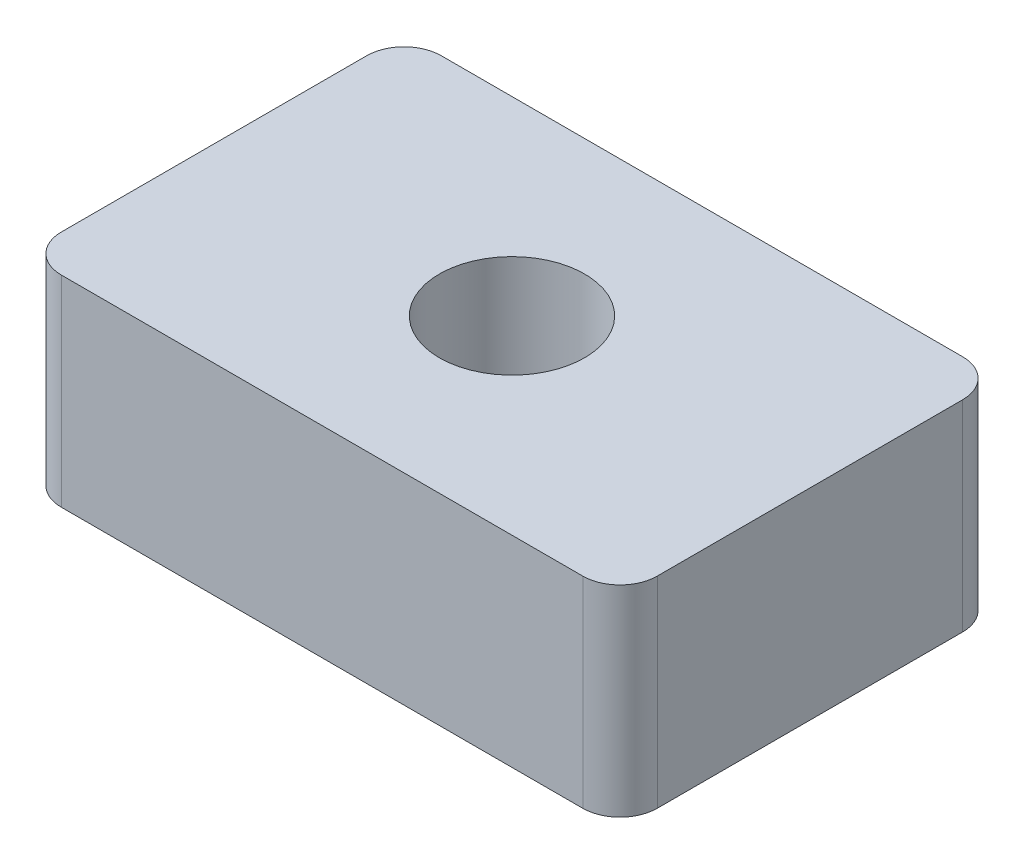
ISO-10303-21;
HEADER;
FILE_DESCRIPTION(('STEP AP214'),'2;1');
FILE_NAME('part.step','',(''),(''),'','','');
FILE_SCHEMA(('AUTOMOTIVE_DESIGN { 1 0 10303 214 1 1 1 1 }'));
ENDSEC;
DATA;
#1=APPLICATION_CONTEXT('core data for automotive mechanical design processes');
#2=APPLICATION_PROTOCOL_DEFINITION('international standard','automotive_design',2000,#1);
#3=PRODUCT_CONTEXT('',#1,'mechanical');
#4=PRODUCT('Part','Part','',(#3));
#5=PRODUCT_RELATED_PRODUCT_CATEGORY('part','',(#4));
#6=PRODUCT_DEFINITION_FORMATION('','',#4);
#7=PRODUCT_DEFINITION_CONTEXT('part definition',#1,'design');
#8=PRODUCT_DEFINITION('design','',#6,#7);
#9=PRODUCT_DEFINITION_SHAPE('','',#8);
#10=(LENGTH_UNIT() NAMED_UNIT(*) SI_UNIT(.MILLI.,.METRE.));
#11=(NAMED_UNIT(*) PLANE_ANGLE_UNIT() SI_UNIT($,.RADIAN.));
#12=(NAMED_UNIT(*) SI_UNIT($,.STERADIAN.) SOLID_ANGLE_UNIT());
#13=UNCERTAINTY_MEASURE_WITH_UNIT(LENGTH_MEASURE(1.E-05),#10,'distance_accuracy_value','');
#14=(GEOMETRIC_REPRESENTATION_CONTEXT(3) GLOBAL_UNCERTAINTY_ASSIGNED_CONTEXT((#13)) GLOBAL_UNIT_ASSIGNED_CONTEXT((#10,
#11,#12)) REPRESENTATION_CONTEXT('',''));
#15=CARTESIAN_POINT('',(0.,0.,0.));
#16=DIRECTION('',(0.,0.,1.));
#17=DIRECTION('',(1.,0.,0.));
#18=AXIS2_PLACEMENT_3D('',#15,#16,#17);
#19=CARTESIAN_POINT('',(0.,27.,0.));
#20=DIRECTION('',(1.,0.,0.));
#21=DIRECTION('',(0.,0.,-1.));
#22=AXIS2_PLACEMENT_3D('',#19,#20,#21);
#23=PLANE('',#22);
#24=DIRECTION('',(0.,0.,1.));
#25=VECTOR('',#24,1.);
#26=CARTESIAN_POINT('',(0.,27.,0.));
#27=LINE('',#26,#25);
#28=CARTESIAN_POINT('',(0.,27.,-46.));
#29=VERTEX_POINT('',#28);
#30=CARTESIAN_POINT('',(0.,27.,-5.));
#31=VERTEX_POINT('',#30);
#32=EDGE_CURVE('E132',#29,#31,#27,.T.);
#33=ORIENTED_EDGE('',*,*,#32,.F.);
#34=DIRECTION('',(0.,-1.,0.));
#35=VECTOR('',#34,1.);
#36=CARTESIAN_POINT('',(0.,27.,-46.));
#37=LINE('',#36,#35);
#38=CARTESIAN_POINT('',(0.,0.,-46.));
#39=VERTEX_POINT('',#38);
#40=EDGE_CURVE('E116',#29,#39,#37,.T.);
#41=ORIENTED_EDGE('',*,*,#40,.T.);
#42=DIRECTION('',(0.,0.,1.));
#43=VECTOR('',#42,1.);
#44=CARTESIAN_POINT('',(0.,0.,0.));
#45=LINE('',#44,#43);
#46=CARTESIAN_POINT('',(0.,0.,-5.));
#47=VERTEX_POINT('',#46);
#48=EDGE_CURVE('E129',#39,#47,#45,.T.);
#49=ORIENTED_EDGE('',*,*,#48,.T.);
#50=DIRECTION('',(0.,-1.,0.));
#51=VECTOR('',#50,1.);
#52=CARTESIAN_POINT('',(0.,27.,-5.));
#53=LINE('',#52,#51);
#54=EDGE_CURVE('E135',#47,#31,#53,.F.);
#55=ORIENTED_EDGE('',*,*,#54,.T.);
#56=EDGE_LOOP('',(#33,#41,#49,#55));
#57=FACE_BOUND('',#56,.T.);
#58=ADVANCED_FACE('F45',(#57),#23,.F.);
#59=CARTESIAN_POINT('',(0.,27.,0.));
#60=DIRECTION('',(0.,0.,-1.));
#61=DIRECTION('',(-1.,0.,0.));
#62=AXIS2_PLACEMENT_3D('',#59,#60,#61);
#63=PLANE('',#62);
#64=DIRECTION('',(1.,0.,0.));
#65=VECTOR('',#64,1.);
#66=CARTESIAN_POINT('',(0.,0.,0.));
#67=LINE('',#66,#65);
#68=CARTESIAN_POINT('',(5.,0.,0.));
#69=VERTEX_POINT('',#68);
#70=CARTESIAN_POINT('',(75.,0.,0.));
#71=VERTEX_POINT('',#70);
#72=EDGE_CURVE('E140',#69,#71,#67,.T.);
#73=ORIENTED_EDGE('',*,*,#72,.T.);
#74=DIRECTION('',(0.,-1.,0.));
#75=VECTOR('',#74,1.);
#76=CARTESIAN_POINT('',(75.,27.,0.));
#77=LINE('',#76,#75);
#78=CARTESIAN_POINT('',(75.,27.,0.));
#79=VERTEX_POINT('',#78);
#80=EDGE_CURVE('E11',#71,#79,#77,.F.);
#81=ORIENTED_EDGE('',*,*,#80,.T.);
#82=DIRECTION('',(1.,0.,0.));
#83=VECTOR('',#82,1.);
#84=CARTESIAN_POINT('',(0.,27.,0.));
#85=LINE('',#84,#83);
#86=CARTESIAN_POINT('',(5.,27.,0.));
#87=VERTEX_POINT('',#86);
#88=EDGE_CURVE('E197',#87,#79,#85,.T.);
#89=ORIENTED_EDGE('',*,*,#88,.F.);
#90=DIRECTION('',(0.,-1.,0.));
#91=VECTOR('',#90,1.);
#92=CARTESIAN_POINT('',(5.,27.,0.));
#93=LINE('',#92,#91);
#94=EDGE_CURVE('E54',#87,#69,#93,.T.);
#95=ORIENTED_EDGE('',*,*,#94,.T.);
#96=EDGE_LOOP('',(#73,#81,#89,#95));
#97=FACE_BOUND('',#96,.T.);
#98=ADVANCED_FACE('F195',(#97),#63,.F.);
#99=CARTESIAN_POINT('',(80.,27.,0.));
#100=DIRECTION('',(-1.,0.,0.));
#101=DIRECTION('',(0.,0.,1.));
#102=AXIS2_PLACEMENT_3D('',#99,#100,#101);
#103=PLANE('',#102);
#104=DIRECTION('',(0.,0.,-1.));
#105=VECTOR('',#104,1.);
#106=CARTESIAN_POINT('',(80.,0.,0.));
#107=LINE('',#106,#105);
#108=CARTESIAN_POINT('',(80.,0.,-5.));
#109=VERTEX_POINT('',#108);
#110=CARTESIAN_POINT('',(80.,0.,-46.));
#111=VERTEX_POINT('',#110);
#112=EDGE_CURVE('E146',#109,#111,#107,.T.);
#113=ORIENTED_EDGE('',*,*,#112,.T.);
#114=DIRECTION('',(0.,-1.,0.));
#115=VECTOR('',#114,1.);
#116=CARTESIAN_POINT('',(80.,27.,-46.));
#117=LINE('',#116,#115);
#118=CARTESIAN_POINT('',(80.,27.,-46.));
#119=VERTEX_POINT('',#118);
#120=EDGE_CURVE('E61',#111,#119,#117,.F.);
#121=ORIENTED_EDGE('',*,*,#120,.T.);
#122=DIRECTION('',(0.,0.,-1.));
#123=VECTOR('',#122,1.);
#124=CARTESIAN_POINT('',(80.,27.,0.));
#125=LINE('',#124,#123);
#126=CARTESIAN_POINT('',(80.,27.,-5.));
#127=VERTEX_POINT('',#126);
#128=EDGE_CURVE('E205',#127,#119,#125,.T.);
#129=ORIENTED_EDGE('',*,*,#128,.F.);
#130=DIRECTION('',(0.,-1.,0.));
#131=VECTOR('',#130,1.);
#132=CARTESIAN_POINT('',(80.,27.,-5.));
#133=LINE('',#132,#131);
#134=EDGE_CURVE('E185',#127,#109,#133,.T.);
#135=ORIENTED_EDGE('',*,*,#134,.T.);
#136=EDGE_LOOP('',(#113,#121,#129,#135));
#137=FACE_BOUND('',#136,.T.);
#138=ADVANCED_FACE('F204',(#137),#103,.F.);
#139=CARTESIAN_POINT('',(0.,27.,-51.));
#140=DIRECTION('',(0.,0.,1.));
#141=DIRECTION('',(1.,0.,0.));
#142=AXIS2_PLACEMENT_3D('',#139,#140,#141);
#143=PLANE('',#142);
#144=DIRECTION('',(-1.,0.,0.));
#145=VECTOR('',#144,1.);
#146=CARTESIAN_POINT('',(0.,0.,-51.));
#147=LINE('',#146,#145);
#148=CARTESIAN_POINT('',(75.,0.,-51.));
#149=VERTEX_POINT('',#148);
#150=CARTESIAN_POINT('',(5.,0.,-51.));
#151=VERTEX_POINT('',#150);
#152=EDGE_CURVE('E157',#149,#151,#147,.T.);
#153=ORIENTED_EDGE('',*,*,#152,.T.);
#154=DIRECTION('',(0.,-1.,0.));
#155=VECTOR('',#154,1.);
#156=CARTESIAN_POINT('',(5.,27.,-51.));
#157=LINE('',#156,#155);
#158=CARTESIAN_POINT('',(5.,27.,-51.));
#159=VERTEX_POINT('',#158);
#160=EDGE_CURVE('E117',#151,#159,#157,.F.);
#161=ORIENTED_EDGE('',*,*,#160,.T.);
#162=DIRECTION('',(-1.,0.,0.));
#163=VECTOR('',#162,1.);
#164=CARTESIAN_POINT('',(0.,27.,-51.));
#165=LINE('',#164,#163);
#166=CARTESIAN_POINT('',(75.,27.,-51.));
#167=VERTEX_POINT('',#166);
#168=EDGE_CURVE('E152',#167,#159,#165,.T.);
#169=ORIENTED_EDGE('',*,*,#168,.F.);
#170=DIRECTION('',(0.,-1.,0.));
#171=VECTOR('',#170,1.);
#172=CARTESIAN_POINT('',(75.,27.,-51.));
#173=LINE('',#172,#171);
#174=EDGE_CURVE('E123',#167,#149,#173,.T.);
#175=ORIENTED_EDGE('',*,*,#174,.T.);
#176=EDGE_LOOP('',(#153,#161,#169,#175));
#177=FACE_BOUND('',#176,.T.);
#178=ADVANCED_FACE('F223',(#177),#143,.F.);
#179=CARTESIAN_POINT('',(0.,27.,0.));
#180=DIRECTION('',(0.,-1.,0.));
#181=DIRECTION('',(0.,0.,-1.));
#182=AXIS2_PLACEMENT_3D('',#179,#180,#181);
#183=PLANE('',#182);
#184=CARTESIAN_POINT('',(40.,27.,-25.5));
#185=DIRECTION('',(0.,1.,0.));
#186=DIRECTION('',(0.,0.,1.));
#187=AXIS2_PLACEMENT_3D('',#184,#185,#186);
#188=CIRCLE('',#187,9.75);
#189=CARTESIAN_POINT('',(40.,27.,-15.75));
#190=VERTEX_POINT('',#189);
#191=EDGE_CURVE('E149',#190,#190,#188,.T.);
#192=ORIENTED_EDGE('',*,*,#191,.F.);
#193=EDGE_LOOP('',(#192));
#194=FACE_BOUND('',#193,.T.);
#195=ORIENTED_EDGE('',*,*,#168,.T.);
#196=CARTESIAN_POINT('',(5.,27.,-46.));
#197=DIRECTION('',(0.,-1.,0.));
#198=DIRECTION('',(0.,0.,-1.));
#199=AXIS2_PLACEMENT_3D('',#196,#197,#198);
#200=CIRCLE('',#199,5.);
#201=EDGE_CURVE('E182',#159,#29,#200,.F.);
#202=ORIENTED_EDGE('',*,*,#201,.T.);
#203=ORIENTED_EDGE('',*,*,#32,.T.);
#204=CARTESIAN_POINT('',(5.,27.,-5.));
#205=DIRECTION('',(0.,-1.,0.));
#206=DIRECTION('',(0.,0.,-1.));
#207=AXIS2_PLACEMENT_3D('',#204,#205,#206);
#208=CIRCLE('',#207,5.);
#209=EDGE_CURVE('E174',#31,#87,#208,.F.);
#210=ORIENTED_EDGE('',*,*,#209,.T.);
#211=ORIENTED_EDGE('',*,*,#88,.T.);
#212=CARTESIAN_POINT('',(75.,27.,-5.));
#213=DIRECTION('',(0.,-1.,0.));
#214=DIRECTION('',(0.,0.,-1.));
#215=AXIS2_PLACEMENT_3D('',#212,#213,#214);
#216=CIRCLE('',#215,5.);
#217=EDGE_CURVE('E68',#79,#127,#216,.F.);
#218=ORIENTED_EDGE('',*,*,#217,.T.);
#219=ORIENTED_EDGE('',*,*,#128,.T.);
#220=CARTESIAN_POINT('',(75.,27.,-46.));
#221=DIRECTION('',(0.,-1.,0.));
#222=DIRECTION('',(0.,0.,-1.));
#223=AXIS2_PLACEMENT_3D('',#220,#221,#222);
#224=CIRCLE('',#223,5.);
#225=EDGE_CURVE('E179',#119,#167,#224,.F.);
#226=ORIENTED_EDGE('',*,*,#225,.T.);
#227=EDGE_LOOP('',(#195,#202,#203,#210,#211,#218,#219,#226));
#228=FACE_BOUND('',#227,.T.);
#229=ADVANCED_FACE('F221',(#194,#228),#183,.F.);
#230=CARTESIAN_POINT('',(0.,0.,0.));
#231=DIRECTION('',(0.,-1.,0.));
#232=DIRECTION('',(0.,0.,-1.));
#233=AXIS2_PLACEMENT_3D('',#230,#231,#232);
#234=PLANE('',#233);
#235=CARTESIAN_POINT('',(40.,0.,-25.5));
#236=DIRECTION('',(0.,1.,0.));
#237=DIRECTION('',(0.,0.,1.));
#238=AXIS2_PLACEMENT_3D('',#235,#236,#237);
#239=CIRCLE('',#238,9.75);
#240=CARTESIAN_POINT('',(40.,0.,-15.75));
#241=VERTEX_POINT('',#240);
#242=EDGE_CURVE('E141',#241,#241,#239,.T.);
#243=ORIENTED_EDGE('',*,*,#242,.T.);
#244=EDGE_LOOP('',(#243));
#245=FACE_BOUND('',#244,.T.);
#246=ORIENTED_EDGE('',*,*,#48,.F.);
#247=CARTESIAN_POINT('',(5.,0.,-46.));
#248=DIRECTION('',(0.,-1.,0.));
#249=DIRECTION('',(0.,0.,-1.));
#250=AXIS2_PLACEMENT_3D('',#247,#248,#249);
#251=CIRCLE('',#250,5.);
#252=EDGE_CURVE('E112',#39,#151,#251,.T.);
#253=ORIENTED_EDGE('',*,*,#252,.T.);
#254=ORIENTED_EDGE('',*,*,#152,.F.);
#255=CARTESIAN_POINT('',(75.,0.,-46.));
#256=DIRECTION('',(0.,-1.,0.));
#257=DIRECTION('',(0.,0.,-1.));
#258=AXIS2_PLACEMENT_3D('',#255,#256,#257);
#259=CIRCLE('',#258,5.);
#260=EDGE_CURVE('E124',#149,#111,#259,.T.);
#261=ORIENTED_EDGE('',*,*,#260,.T.);
#262=ORIENTED_EDGE('',*,*,#112,.F.);
#263=CARTESIAN_POINT('',(75.,0.,-5.));
#264=DIRECTION('',(0.,-1.,0.));
#265=DIRECTION('',(0.,0.,-1.));
#266=AXIS2_PLACEMENT_3D('',#263,#264,#265);
#267=CIRCLE('',#266,5.);
#268=EDGE_CURVE('E164',#109,#71,#267,.T.);
#269=ORIENTED_EDGE('',*,*,#268,.T.);
#270=ORIENTED_EDGE('',*,*,#72,.F.);
#271=CARTESIAN_POINT('',(5.,0.,-5.));
#272=DIRECTION('',(0.,-1.,0.));
#273=DIRECTION('',(0.,0.,-1.));
#274=AXIS2_PLACEMENT_3D('',#271,#272,#273);
#275=CIRCLE('',#274,5.);
#276=EDGE_CURVE('E134',#69,#47,#275,.T.);
#277=ORIENTED_EDGE('',*,*,#276,.T.);
#278=EDGE_LOOP('',(#246,#253,#254,#261,#262,#269,#270,#277));
#279=FACE_BOUND('',#278,.T.);
#280=ADVANCED_FACE('F137',(#245,#279),#234,.T.);
#281=CARTESIAN_POINT('',(40.,0.,-25.5));
#282=DIRECTION('',(0.,1.,0.));
#283=DIRECTION('',(0.,0.,1.));
#284=AXIS2_PLACEMENT_3D('',#281,#282,#283);
#285=CYLINDRICAL_SURFACE('',#284,9.75);
#286=ORIENTED_EDGE('',*,*,#242,.F.);
#287=EDGE_LOOP('',(#286));
#288=FACE_BOUND('',#287,.T.);
#289=ORIENTED_EDGE('',*,*,#191,.T.);
#290=EDGE_LOOP('',(#289));
#291=FACE_BOUND('',#290,.T.);
#292=ADVANCED_FACE('F219',(#288,#291),#285,.F.);
#293=CARTESIAN_POINT('',(5.,27.,-46.));
#294=DIRECTION('',(0.,-1.,0.));
#295=DIRECTION('',(0.,0.,-1.));
#296=AXIS2_PLACEMENT_3D('',#293,#294,#295);
#297=CYLINDRICAL_SURFACE('',#296,5.);
#298=ORIENTED_EDGE('',*,*,#201,.F.);
#299=ORIENTED_EDGE('',*,*,#160,.F.);
#300=ORIENTED_EDGE('',*,*,#252,.F.);
#301=ORIENTED_EDGE('',*,*,#40,.F.);
#302=EDGE_LOOP('',(#298,#299,#300,#301));
#303=FACE_BOUND('',#302,.T.);
#304=ADVANCED_FACE('F115',(#303),#297,.T.);
#305=CARTESIAN_POINT('',(75.,27.,-46.));
#306=DIRECTION('',(0.,-1.,0.));
#307=DIRECTION('',(0.,0.,-1.));
#308=AXIS2_PLACEMENT_3D('',#305,#306,#307);
#309=CYLINDRICAL_SURFACE('',#308,5.);
#310=ORIENTED_EDGE('',*,*,#225,.F.);
#311=ORIENTED_EDGE('',*,*,#120,.F.);
#312=ORIENTED_EDGE('',*,*,#260,.F.);
#313=ORIENTED_EDGE('',*,*,#174,.F.);
#314=EDGE_LOOP('',(#310,#311,#312,#313));
#315=FACE_BOUND('',#314,.T.);
#316=ADVANCED_FACE('F229',(#315),#309,.T.);
#317=CARTESIAN_POINT('',(75.,27.,-5.));
#318=DIRECTION('',(0.,-1.,0.));
#319=DIRECTION('',(0.,0.,-1.));
#320=AXIS2_PLACEMENT_3D('',#317,#318,#319);
#321=CYLINDRICAL_SURFACE('',#320,5.);
#322=ORIENTED_EDGE('',*,*,#217,.F.);
#323=ORIENTED_EDGE('',*,*,#80,.F.);
#324=ORIENTED_EDGE('',*,*,#268,.F.);
#325=ORIENTED_EDGE('',*,*,#134,.F.);
#326=EDGE_LOOP('',(#322,#323,#324,#325));
#327=FACE_BOUND('',#326,.T.);
#328=ADVANCED_FACE('F203',(#327),#321,.T.);
#329=CARTESIAN_POINT('',(5.,27.,-5.));
#330=DIRECTION('',(0.,-1.,0.));
#331=DIRECTION('',(0.,0.,-1.));
#332=AXIS2_PLACEMENT_3D('',#329,#330,#331);
#333=CYLINDRICAL_SURFACE('',#332,5.);
#334=ORIENTED_EDGE('',*,*,#209,.F.);
#335=ORIENTED_EDGE('',*,*,#54,.F.);
#336=ORIENTED_EDGE('',*,*,#276,.F.);
#337=ORIENTED_EDGE('',*,*,#94,.F.);
#338=EDGE_LOOP('',(#334,#335,#336,#337));
#339=FACE_BOUND('',#338,.T.);
#340=ADVANCED_FACE('F47',(#339),#333,.T.);
#341=CLOSED_SHELL('',(#58,#98,#138,#178,#229,#280,#292,#304,#316,#328,#340));
#342=MANIFOLD_SOLID_BREP('B2',#341);
#343=ADVANCED_BREP_SHAPE_REPRESENTATION('',(#18,#342),#14);
#344=SHAPE_DEFINITION_REPRESENTATION(#9,#343);
ENDSEC;
END-ISO-10303-21;
